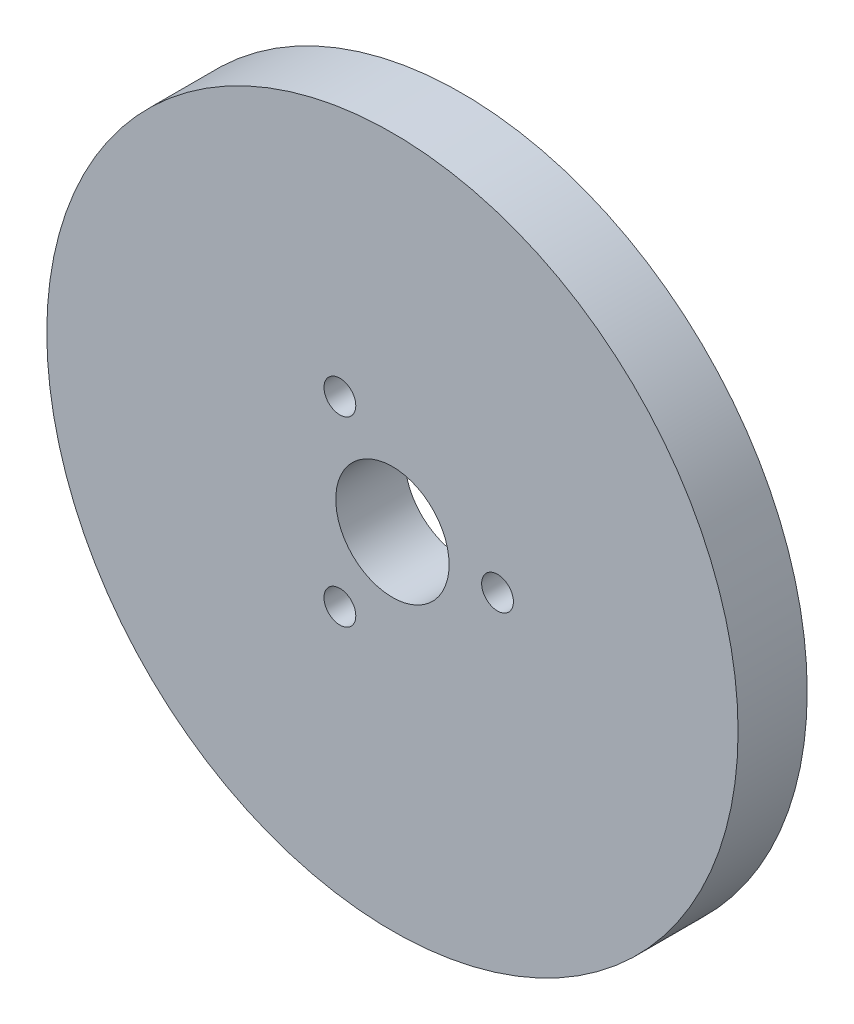
ISO-10303-21;
HEADER;
FILE_DESCRIPTION(('STEP AP214'),'2;1');
FILE_NAME('part.step','',(''),(''),'','','');
FILE_SCHEMA(('AUTOMOTIVE_DESIGN { 1 0 10303 214 1 1 1 1 }'));
ENDSEC;
DATA;
#1=APPLICATION_CONTEXT('core data for automotive mechanical design processes');
#2=APPLICATION_PROTOCOL_DEFINITION('international standard','automotive_design',2000,#1);
#3=PRODUCT_CONTEXT('',#1,'mechanical');
#4=PRODUCT('Part','Part','',(#3));
#5=PRODUCT_RELATED_PRODUCT_CATEGORY('part','',(#4));
#6=PRODUCT_DEFINITION_FORMATION('','',#4);
#7=PRODUCT_DEFINITION_CONTEXT('part definition',#1,'design');
#8=PRODUCT_DEFINITION('design','',#6,#7);
#9=PRODUCT_DEFINITION_SHAPE('','',#8);
#10=(LENGTH_UNIT() NAMED_UNIT(*) SI_UNIT(.MILLI.,.METRE.));
#11=(NAMED_UNIT(*) PLANE_ANGLE_UNIT() SI_UNIT($,.RADIAN.));
#12=(NAMED_UNIT(*) SI_UNIT($,.STERADIAN.) SOLID_ANGLE_UNIT());
#13=UNCERTAINTY_MEASURE_WITH_UNIT(LENGTH_MEASURE(1.E-05),#10,'distance_accuracy_value','');
#14=(GEOMETRIC_REPRESENTATION_CONTEXT(3) GLOBAL_UNCERTAINTY_ASSIGNED_CONTEXT((#13)) GLOBAL_UNIT_ASSIGNED_CONTEXT((#10,
#11,#12)) REPRESENTATION_CONTEXT('',''));
#15=CARTESIAN_POINT('',(0.,0.,0.));
#16=DIRECTION('',(0.,0.,1.));
#17=DIRECTION('',(1.,0.,0.));
#18=AXIS2_PLACEMENT_3D('',#15,#16,#17);
#19=CARTESIAN_POINT('',(0.,0.,0.));
#20=DIRECTION('',(0.,0.,1.));
#21=DIRECTION('',(1.,0.,0.));
#22=AXIS2_PLACEMENT_3D('',#19,#20,#21);
#23=PLANE('',#22);
#24=CARTESIAN_POINT('',(0.,0.,0.));
#25=DIRECTION('',(0.,0.,1.));
#26=DIRECTION('',(1.,0.,0.));
#27=AXIS2_PLACEMENT_3D('',#24,#25,#26);
#28=CIRCLE('',#27,4.1);
#29=CARTESIAN_POINT('',(4.1,0.,0.));
#30=VERTEX_POINT('',#29);
#31=EDGE_CURVE('E10',#30,#30,#28,.T.);
#32=ORIENTED_EDGE('',*,*,#31,.F.);
#33=EDGE_LOOP('',(#32));
#34=FACE_BOUND('',#33,.T.);
#35=CARTESIAN_POINT('',(0.,0.,0.));
#36=DIRECTION('',(0.,0.,1.));
#37=DIRECTION('',(1.,0.,0.));
#38=AXIS2_PLACEMENT_3D('',#35,#36,#37);
#39=CIRCLE('',#38,25.);
#40=CARTESIAN_POINT('',(25.,0.,0.));
#41=VERTEX_POINT('',#40);
#42=EDGE_CURVE('E42',#41,#41,#39,.T.);
#43=ORIENTED_EDGE('',*,*,#42,.T.);
#44=EDGE_LOOP('',(#43));
#45=FACE_BOUND('',#44,.T.);
#46=CARTESIAN_POINT('',(7.6,0.,0.));
#47=DIRECTION('',(0.,0.,1.));
#48=DIRECTION('',(1.,0.,0.));
#49=AXIS2_PLACEMENT_3D('',#46,#47,#48);
#50=CIRCLE('',#49,1.15);
#51=CARTESIAN_POINT('',(8.75,0.,0.));
#52=VERTEX_POINT('',#51);
#53=EDGE_CURVE('E50',#52,#52,#50,.T.);
#54=ORIENTED_EDGE('',*,*,#53,.F.);
#55=EDGE_LOOP('',(#54));
#56=FACE_BOUND('',#55,.T.);
#57=CARTESIAN_POINT('',(-3.8,-6.58179306876166,0.));
#58=DIRECTION('',(0.,0.,1.));
#59=DIRECTION('',(1.,0.,0.));
#60=AXIS2_PLACEMENT_3D('',#57,#58,#59);
#61=CIRCLE('',#60,1.14999999999991);
#62=CARTESIAN_POINT('',(-2.65000000000009,-6.58179306876166,0.));
#63=VERTEX_POINT('',#62);
#64=EDGE_CURVE('E56',#63,#63,#61,.T.);
#65=ORIENTED_EDGE('',*,*,#64,.F.);
#66=EDGE_LOOP('',(#65));
#67=FACE_BOUND('',#66,.T.);
#68=CARTESIAN_POINT('',(-3.79999999999994,6.58179306876177,0.));
#69=DIRECTION('',(0.,0.,1.));
#70=DIRECTION('',(1.,0.,0.));
#71=AXIS2_PLACEMENT_3D('',#68,#69,#70);
#72=CIRCLE('',#71,1.15);
#73=CARTESIAN_POINT('',(-2.64999999999994,6.58179306876177,0.));
#74=VERTEX_POINT('',#73);
#75=EDGE_CURVE('E62',#74,#74,#72,.T.);
#76=ORIENTED_EDGE('',*,*,#75,.F.);
#77=EDGE_LOOP('',(#76));
#78=FACE_BOUND('',#77,.T.);
#79=ADVANCED_FACE('F31',(#34,#45,#56,#67,#78),#23,.T.);
#80=CARTESIAN_POINT('',(0.,0.,-5.));
#81=DIRECTION('',(0.,0.,1.));
#82=DIRECTION('',(1.,0.,0.));
#83=AXIS2_PLACEMENT_3D('',#80,#81,#82);
#84=PLANE('',#83);
#85=CARTESIAN_POINT('',(0.,0.,-5.));
#86=DIRECTION('',(0.,0.,1.));
#87=DIRECTION('',(1.,0.,0.));
#88=AXIS2_PLACEMENT_3D('',#85,#86,#87);
#89=CIRCLE('',#88,4.1);
#90=CARTESIAN_POINT('',(4.1,0.,-5.));
#91=VERTEX_POINT('',#90);
#92=EDGE_CURVE('E35',#91,#91,#89,.T.);
#93=ORIENTED_EDGE('',*,*,#92,.T.);
#94=EDGE_LOOP('',(#93));
#95=FACE_BOUND('',#94,.T.);
#96=CARTESIAN_POINT('',(0.,0.,-5.));
#97=DIRECTION('',(0.,0.,1.));
#98=DIRECTION('',(1.,0.,0.));
#99=AXIS2_PLACEMENT_3D('',#96,#97,#98);
#100=CIRCLE('',#99,25.);
#101=CARTESIAN_POINT('',(25.,0.,-5.));
#102=VERTEX_POINT('',#101);
#103=EDGE_CURVE('E44',#102,#102,#100,.T.);
#104=ORIENTED_EDGE('',*,*,#103,.F.);
#105=EDGE_LOOP('',(#104));
#106=FACE_BOUND('',#105,.T.);
#107=CARTESIAN_POINT('',(7.6,0.,-5.));
#108=DIRECTION('',(0.,0.,1.));
#109=DIRECTION('',(1.,0.,0.));
#110=AXIS2_PLACEMENT_3D('',#107,#108,#109);
#111=CIRCLE('',#110,1.15);
#112=CARTESIAN_POINT('',(8.75,0.,-5.));
#113=VERTEX_POINT('',#112);
#114=EDGE_CURVE('E47',#113,#113,#111,.T.);
#115=ORIENTED_EDGE('',*,*,#114,.T.);
#116=EDGE_LOOP('',(#115));
#117=FACE_BOUND('',#116,.T.);
#118=CARTESIAN_POINT('',(-3.8,-6.58179306876166,-5.));
#119=DIRECTION('',(0.,0.,1.));
#120=DIRECTION('',(1.,0.,0.));
#121=AXIS2_PLACEMENT_3D('',#118,#119,#120);
#122=CIRCLE('',#121,1.14999999999991);
#123=CARTESIAN_POINT('',(-2.65000000000009,-6.58179306876166,-5.));
#124=VERTEX_POINT('',#123);
#125=EDGE_CURVE('E53',#124,#124,#122,.T.);
#126=ORIENTED_EDGE('',*,*,#125,.T.);
#127=EDGE_LOOP('',(#126));
#128=FACE_BOUND('',#127,.T.);
#129=CARTESIAN_POINT('',(-3.79999999999994,6.58179306876177,-5.));
#130=DIRECTION('',(0.,0.,1.));
#131=DIRECTION('',(1.,0.,0.));
#132=AXIS2_PLACEMENT_3D('',#129,#130,#131);
#133=CIRCLE('',#132,1.15);
#134=CARTESIAN_POINT('',(-2.64999999999994,6.58179306876177,-5.));
#135=VERTEX_POINT('',#134);
#136=EDGE_CURVE('E59',#135,#135,#133,.T.);
#137=ORIENTED_EDGE('',*,*,#136,.T.);
#138=EDGE_LOOP('',(#137));
#139=FACE_BOUND('',#138,.T.);
#140=ADVANCED_FACE('F33',(#95,#106,#117,#128,#139),#84,.F.);
#141=CARTESIAN_POINT('',(0.,0.,0.));
#142=DIRECTION('',(0.,0.,-1.));
#143=DIRECTION('',(-1.,0.,0.));
#144=AXIS2_PLACEMENT_3D('',#141,#142,#143);
#145=CYLINDRICAL_SURFACE('',#144,4.1);
#146=ORIENTED_EDGE('',*,*,#31,.T.);
#147=EDGE_LOOP('',(#146));
#148=FACE_BOUND('',#147,.T.);
#149=ORIENTED_EDGE('',*,*,#92,.F.);
#150=EDGE_LOOP('',(#149));
#151=FACE_BOUND('',#150,.T.);
#152=ADVANCED_FACE('F81',(#148,#151),#145,.F.);
#153=CARTESIAN_POINT('',(0.,0.,70.7106781186548));
#154=DIRECTION('',(0.,0.,-1.));
#155=DIRECTION('',(-1.,0.,0.));
#156=AXIS2_PLACEMENT_3D('',#153,#154,#155);
#157=CYLINDRICAL_SURFACE('',#156,25.);
#158=ORIENTED_EDGE('',*,*,#103,.T.);
#159=EDGE_LOOP('',(#158));
#160=FACE_BOUND('',#159,.T.);
#161=ORIENTED_EDGE('',*,*,#42,.F.);
#162=EDGE_LOOP('',(#161));
#163=FACE_BOUND('',#162,.T.);
#164=ADVANCED_FACE('F87',(#160,#163),#157,.T.);
#165=CARTESIAN_POINT('',(7.6,0.,-5.));
#166=DIRECTION('',(0.,0.,1.));
#167=DIRECTION('',(1.,0.,0.));
#168=AXIS2_PLACEMENT_3D('',#165,#166,#167);
#169=CYLINDRICAL_SURFACE('',#168,1.15);
#170=ORIENTED_EDGE('',*,*,#114,.F.);
#171=EDGE_LOOP('',(#170));
#172=FACE_BOUND('',#171,.T.);
#173=ORIENTED_EDGE('',*,*,#53,.T.);
#174=EDGE_LOOP('',(#173));
#175=FACE_BOUND('',#174,.T.);
#176=ADVANCED_FACE('F90',(#172,#175),#169,.F.);
#177=CARTESIAN_POINT('',(-3.8,-6.58179306876166,-5.));
#178=DIRECTION('',(0.,0.,1.));
#179=DIRECTION('',(1.,0.,0.));
#180=AXIS2_PLACEMENT_3D('',#177,#178,#179);
#181=CYLINDRICAL_SURFACE('',#180,1.14999999999991);
#182=ORIENTED_EDGE('',*,*,#125,.F.);
#183=EDGE_LOOP('',(#182));
#184=FACE_BOUND('',#183,.T.);
#185=ORIENTED_EDGE('',*,*,#64,.T.);
#186=EDGE_LOOP('',(#185));
#187=FACE_BOUND('',#186,.T.);
#188=ADVANCED_FACE('F72',(#184,#187),#181,.F.);
#189=CARTESIAN_POINT('',(-3.79999999999994,6.58179306876177,-5.));
#190=DIRECTION('',(0.,0.,1.));
#191=DIRECTION('',(1.,0.,0.));
#192=AXIS2_PLACEMENT_3D('',#189,#190,#191);
#193=CYLINDRICAL_SURFACE('',#192,1.15);
#194=ORIENTED_EDGE('',*,*,#136,.F.);
#195=EDGE_LOOP('',(#194));
#196=FACE_BOUND('',#195,.T.);
#197=ORIENTED_EDGE('',*,*,#75,.T.);
#198=EDGE_LOOP('',(#197));
#199=FACE_BOUND('',#198,.T.);
#200=ADVANCED_FACE('F69',(#196,#199),#193,.F.);
#201=CLOSED_SHELL('',(#79,#140,#152,#164,#176,#188,#200));
#202=MANIFOLD_SOLID_BREP('B2',#201);
#203=ADVANCED_BREP_SHAPE_REPRESENTATION('',(#18,#202),#14);
#204=SHAPE_DEFINITION_REPRESENTATION(#9,#203);
ENDSEC;
END-ISO-10303-21;
